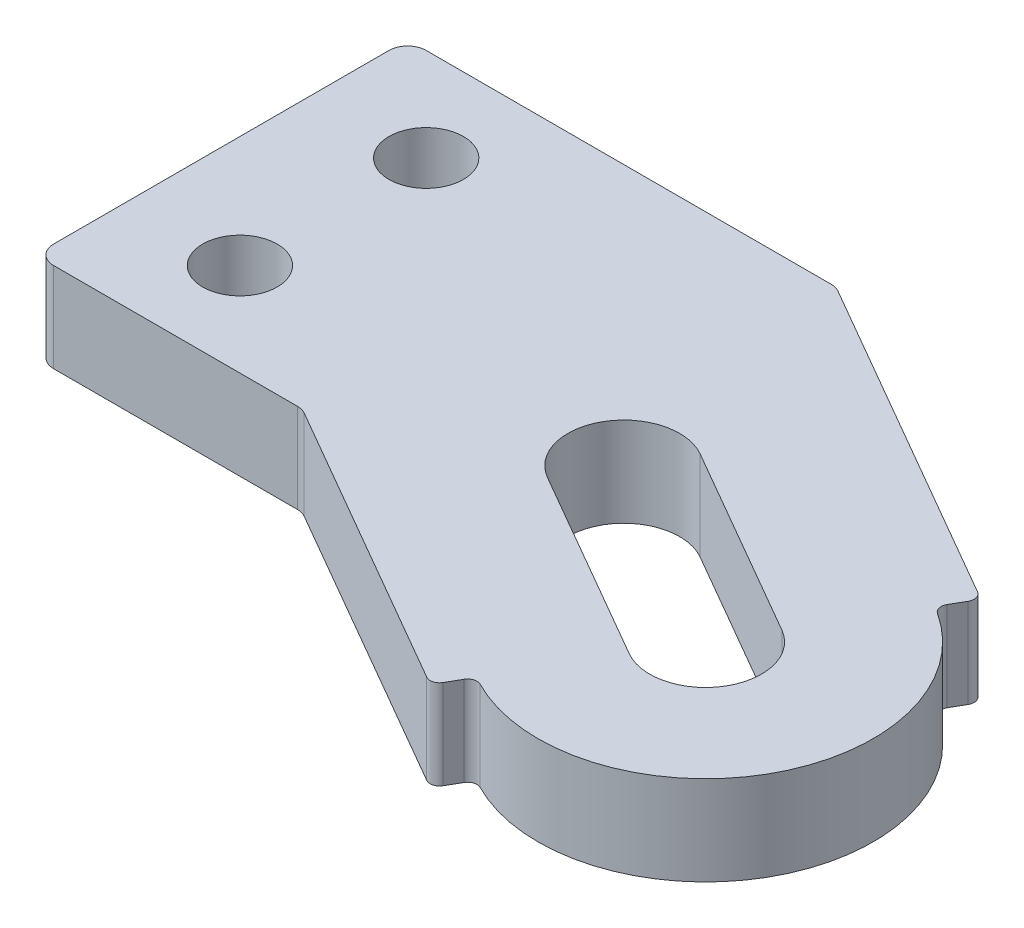
ISO-10303-21;
HEADER;
FILE_DESCRIPTION(('STEP AP214'),'2;1');
FILE_NAME('part.step','',(''),(''),'','','');
FILE_SCHEMA(('AUTOMOTIVE_DESIGN { 1 0 10303 214 1 1 1 1 }'));
ENDSEC;
DATA;
#1=APPLICATION_CONTEXT('core data for automotive mechanical design processes');
#2=APPLICATION_PROTOCOL_DEFINITION('international standard','automotive_design',2000,#1);
#3=PRODUCT_CONTEXT('',#1,'mechanical');
#4=PRODUCT('Part','Part','',(#3));
#5=PRODUCT_RELATED_PRODUCT_CATEGORY('part','',(#4));
#6=PRODUCT_DEFINITION_FORMATION('','',#4);
#7=PRODUCT_DEFINITION_CONTEXT('part definition',#1,'design');
#8=PRODUCT_DEFINITION('design','',#6,#7);
#9=PRODUCT_DEFINITION_SHAPE('','',#8);
#10=(LENGTH_UNIT() NAMED_UNIT(*) SI_UNIT(.MILLI.,.METRE.));
#11=(NAMED_UNIT(*) PLANE_ANGLE_UNIT() SI_UNIT($,.RADIAN.));
#12=(NAMED_UNIT(*) SI_UNIT($,.STERADIAN.) SOLID_ANGLE_UNIT());
#13=UNCERTAINTY_MEASURE_WITH_UNIT(LENGTH_MEASURE(1.E-05),#10,'distance_accuracy_value','');
#14=(GEOMETRIC_REPRESENTATION_CONTEXT(3) GLOBAL_UNCERTAINTY_ASSIGNED_CONTEXT((#13)) GLOBAL_UNIT_ASSIGNED_CONTEXT((#10,
#11,#12)) REPRESENTATION_CONTEXT('',''));
#15=CARTESIAN_POINT('',(0.,0.,0.));
#16=DIRECTION('',(0.,0.,1.));
#17=DIRECTION('',(1.,0.,0.));
#18=AXIS2_PLACEMENT_3D('',#15,#16,#17);
#19=CARTESIAN_POINT('',(6.80469575708595,6.,1.25));
#20=DIRECTION('',(0.,-1.,0.));
#21=DIRECTION('',(0.,0.,-1.));
#22=AXIS2_PLACEMENT_3D('',#19,#20,#21);
#23=PLANE('',#22);
#24=CARTESIAN_POINT('',(-14.1190975631527,6.,6.25));
#25=DIRECTION('',(0.,1.,0.));
#26=DIRECTION('',(0.,0.,-1.));
#27=AXIS2_PLACEMENT_3D('',#24,#25,#26);
#28=CIRCLE('',#27,2.5);
#29=CARTESIAN_POINT('',(-14.1190975631527,6.,3.75));
#30=VERTEX_POINT('',#29);
#31=EDGE_CURVE('E206',#30,#30,#28,.T.);
#32=ORIENTED_EDGE('',*,*,#31,.F.);
#33=EDGE_LOOP('',(#32));
#34=FACE_BOUND('',#33,.T.);
#35=CARTESIAN_POINT('',(-14.1190975631527,6.,18.75));
#36=DIRECTION('',(0.,1.,0.));
#37=DIRECTION('',(0.,0.,1.));
#38=AXIS2_PLACEMENT_3D('',#35,#36,#37);
#39=CIRCLE('',#38,2.5);
#40=CARTESIAN_POINT('',(-14.1190975631527,6.,21.25));
#41=VERTEX_POINT('',#40);
#42=EDGE_CURVE('E212',#41,#41,#39,.T.);
#43=ORIENTED_EDGE('',*,*,#42,.F.);
#44=EDGE_LOOP('',(#43));
#45=FACE_BOUND('',#44,.T.);
#46=CARTESIAN_POINT('',(6.80469575708595,6.,1.25));
#47=DIRECTION('',(0.,1.,0.));
#48=DIRECTION('',(0.,0.,-1.));
#49=AXIS2_PLACEMENT_3D('',#46,#47,#48);
#50=CIRCLE('',#49,1.24999999999999);
#51=CARTESIAN_POINT('',(7.42969575708592,6.,0.167468245269444));
#52=VERTEX_POINT('',#51);
#53=CARTESIAN_POINT('',(6.80469575708593,6.,0.));
#54=VERTEX_POINT('',#53);
#55=EDGE_CURVE('E218',#52,#54,#50,.T.);
#56=ORIENTED_EDGE('',*,*,#55,.T.);
#57=DIRECTION('',(-1.,0.,0.));
#58=VECTOR('',#57,1.);
#59=CARTESIAN_POINT('',(-20.3690975631527,6.,0.));
#60=LINE('',#59,#58);
#61=CARTESIAN_POINT('',(-20.3690975631527,6.,0.));
#62=VERTEX_POINT('',#61);
#63=EDGE_CURVE('E221',#54,#62,#60,.T.);
#64=ORIENTED_EDGE('',*,*,#63,.T.);
#65=CARTESIAN_POINT('',(-20.3690975631527,6.,1.25));
#66=DIRECTION('',(0.,1.,0.));
#67=DIRECTION('',(0.,0.,1.));
#68=AXIS2_PLACEMENT_3D('',#65,#66,#67);
#69=CIRCLE('',#68,1.25);
#70=CARTESIAN_POINT('',(-21.6190975631527,6.,1.25000000000001));
#71=VERTEX_POINT('',#70);
#72=EDGE_CURVE('E224',#62,#71,#69,.T.);
#73=ORIENTED_EDGE('',*,*,#72,.T.);
#74=DIRECTION('',(0.,0.,1.));
#75=VECTOR('',#74,1.);
#76=CARTESIAN_POINT('',(-21.6190975631527,6.,1.25000000000001));
#77=LINE('',#76,#75);
#78=CARTESIAN_POINT('',(-21.6190975631527,6.,23.75));
#79=VERTEX_POINT('',#78);
#80=EDGE_CURVE('E226',#71,#79,#77,.T.);
#81=ORIENTED_EDGE('',*,*,#80,.T.);
#82=CARTESIAN_POINT('',(-20.3690975631527,6.,23.75));
#83=DIRECTION('',(0.,1.,0.));
#84=DIRECTION('',(0.,0.,1.));
#85=AXIS2_PLACEMENT_3D('',#82,#83,#84);
#86=CIRCLE('',#85,1.25);
#87=CARTESIAN_POINT('',(-20.3690975631527,6.,25.));
#88=VERTEX_POINT('',#87);
#89=EDGE_CURVE('E228',#79,#88,#86,.T.);
#90=ORIENTED_EDGE('',*,*,#89,.T.);
#91=DIRECTION('',(1.,0.,0.));
#92=VECTOR('',#91,1.);
#93=CARTESIAN_POINT('',(-20.3690975631527,6.,25.));
#94=LINE('',#93,#92);
#95=CARTESIAN_POINT('',(-4.01403405369189,6.,25.));
#96=VERTEX_POINT('',#95);
#97=EDGE_CURVE('E230',#88,#96,#94,.T.);
#98=ORIENTED_EDGE('',*,*,#97,.T.);
#99=CARTESIAN_POINT('',(-4.0140340536919,6.,26.25));
#100=DIRECTION('',(0.,-1.,0.));
#101=DIRECTION('',(0.,0.,1.));
#102=AXIS2_PLACEMENT_3D('',#99,#100,#101);
#103=CIRCLE('',#102,1.25000000000001);
#104=CARTESIAN_POINT('',(-3.38903405369189,6.,25.1674682452695));
#105=VERTEX_POINT('',#104);
#106=EDGE_CURVE('E232',#96,#105,#103,.T.);
#107=ORIENTED_EDGE('',*,*,#106,.T.);
#108=DIRECTION('',(0.866025403784441,0.,0.499999999999995));
#109=VECTOR('',#108,1.);
#110=CARTESIAN_POINT('',(16.0703064324632,6.,36.4023237132035));
#111=LINE('',#110,#109);
#112=CARTESIAN_POINT('',(16.0703064324632,6.,36.4023237132035));
#113=VERTEX_POINT('',#112);
#114=EDGE_CURVE('E234',#105,#113,#111,.T.);
#115=ORIENTED_EDGE('',*,*,#114,.T.);
#116=CARTESIAN_POINT('',(16.3853064324631,6.,35.8567277088193));
#117=DIRECTION('',(0.,1.,0.));
#118=DIRECTION('',(0.,0.,-1.));
#119=AXIS2_PLACEMENT_3D('',#116,#117,#118);
#120=CIRCLE('',#119,0.629999999999999);
#121=CARTESIAN_POINT('',(16.9309024368473,6.,36.1717277088193));
#122=VERTEX_POINT('',#121);
#123=EDGE_CURVE('E236',#113,#122,#120,.T.);
#124=ORIENTED_EDGE('',*,*,#123,.T.);
#125=DIRECTION('',(0.500000000000004,0.,-0.866025403784436));
#126=VECTOR('',#125,1.);
#127=CARTESIAN_POINT('',(17.4492605899385,6.,35.2739050511478));
#128=LINE('',#127,#126);
#129=CARTESIAN_POINT('',(17.4492605899385,6.,35.2739050511478));
#130=VERTEX_POINT('',#129);
#131=EDGE_CURVE('E238',#122,#130,#128,.T.);
#132=ORIENTED_EDGE('',*,*,#131,.T.);
#133=CARTESIAN_POINT('',(17.9948565943227,6.,35.5889050511478));
#134=DIRECTION('',(0.,-1.,0.));
#135=DIRECTION('',(0.,0.,1.));
#136=AXIS2_PLACEMENT_3D('',#133,#134,#135);
#137=CIRCLE('',#136,0.629999999999999);
#138=CARTESIAN_POINT('',(18.2804802374869,6.,35.0273722075263));
#139=VERTEX_POINT('',#138);
#140=EDGE_CURVE('E240',#130,#139,#137,.T.);
#141=ORIENTED_EDGE('',*,*,#140,.T.);
#142=CARTESIAN_POINT('',(23.3809024368473,6.,25.));
#143=DIRECTION('',(0.,1.,0.));
#144=DIRECTION('',(0.,0.,1.));
#145=AXIS2_PLACEMENT_3D('',#142,#143,#144);
#146=CIRCLE('',#145,11.25);
#147=CARTESIAN_POINT('',(29.5146504020868,6.,15.5692187015646));
#148=VERTEX_POINT('',#147);
#149=EDGE_CURVE('E242',#139,#148,#146,.T.);
#150=ORIENTED_EDGE('',*,*,#149,.T.);
#151=CARTESIAN_POINT('',(29.8581402881402,6.,15.0410949488522));
#152=DIRECTION('',(0.,-1.,0.));
#153=DIRECTION('',(0.,0.,-1.));
#154=AXIS2_PLACEMENT_3D('',#151,#152,#153);
#155=CIRCLE('',#154,0.629999999999999);
#156=CARTESIAN_POINT('',(29.312544283756,6.,14.7260949488522));
#157=VERTEX_POINT('',#156);
#158=EDGE_CURVE('E244',#148,#157,#155,.T.);
#159=ORIENTED_EDGE('',*,*,#158,.T.);
#160=DIRECTION('',(0.499999999999998,0.,-0.86602540378444));
#161=VECTOR('',#160,1.);
#162=CARTESIAN_POINT('',(29.312544283756,6.,14.7260949488522));
#163=LINE('',#162,#161);
#164=CARTESIAN_POINT('',(29.8309024368472,6.,13.8282722911807));
#165=VERTEX_POINT('',#164);
#166=EDGE_CURVE('E246',#157,#165,#163,.T.);
#167=ORIENTED_EDGE('',*,*,#166,.T.);
#168=CARTESIAN_POINT('',(29.285306432463,6.,13.5132722911807));
#169=DIRECTION('',(0.,1.,0.));
#170=DIRECTION('',(0.,0.,-1.));
#171=AXIS2_PLACEMENT_3D('',#168,#169,#170);
#172=CIRCLE('',#171,0.630000000000001);
#173=CARTESIAN_POINT('',(29.600306432463,6.,12.9676762867965));
#174=VERTEX_POINT('',#173);
#175=EDGE_CURVE('E248',#165,#174,#172,.T.);
#176=ORIENTED_EDGE('',*,*,#175,.T.);
#177=DIRECTION('',(-0.866025403784443,0.,-0.499999999999992));
#178=VECTOR('',#177,1.);
#179=CARTESIAN_POINT('',(29.600306432463,6.,12.9676762867965));
#180=LINE('',#179,#178);
#181=EDGE_CURVE('E250',#174,#52,#180,.T.);
#182=ORIENTED_EDGE('',*,*,#181,.T.);
#183=EDGE_LOOP('',(#56,#64,#73,#81,#90,#98,#107,#115,#124,#132,#141,#150,#159,#167,#176,#182));
#184=FACE_BOUND('',#183,.T.);
#185=CARTESIAN_POINT('',(23.3809024368473,6.,25.));
#186=DIRECTION('',(0.,1.,0.));
#187=DIRECTION('',(0.,0.,1.));
#188=AXIS2_PLACEMENT_3D('',#185,#186,#187);
#189=CIRCLE('',#188,3.75);
#190=CARTESIAN_POINT('',(21.5059024368473,6.,28.2475952641917));
#191=VERTEX_POINT('',#190);
#192=CARTESIAN_POINT('',(25.2559024368473,6.,21.7524047358083));
#193=VERTEX_POINT('',#192);
#194=EDGE_CURVE('E170',#191,#193,#189,.T.);
#195=ORIENTED_EDGE('',*,*,#194,.F.);
#196=DIRECTION('',(0.86602540378444,0.,0.499999999999998));
#197=VECTOR('',#196,1.);
#198=CARTESIAN_POINT('',(21.5059024368473,6.,28.2475952641917));
#199=LINE('',#198,#197);
#200=CARTESIAN_POINT('',(8.5155213800807,6.,20.7475952641917));
#201=VERTEX_POINT('',#200);
#202=EDGE_CURVE('E192',#201,#191,#199,.T.);
#203=ORIENTED_EDGE('',*,*,#202,.F.);
#204=CARTESIAN_POINT('',(10.3905213800806,6.,17.5000000000001));
#205=DIRECTION('',(0.,1.,0.));
#206=DIRECTION('',(0.,0.,1.));
#207=AXIS2_PLACEMENT_3D('',#204,#205,#206);
#208=CIRCLE('',#207,3.74999999999994);
#209=CARTESIAN_POINT('',(12.2655213800806,6.,14.2524047358085));
#210=VERTEX_POINT('',#209);
#211=EDGE_CURVE('E190',#210,#201,#208,.T.);
#212=ORIENTED_EDGE('',*,*,#211,.F.);
#213=DIRECTION('',(-0.866025403784444,0.,-0.499999999999991));
#214=VECTOR('',#213,1.);
#215=CARTESIAN_POINT('',(25.2559024368473,6.,21.7524047358083));
#216=LINE('',#215,#214);
#217=EDGE_CURVE('E178',#193,#210,#216,.T.);
#218=ORIENTED_EDGE('',*,*,#217,.F.);
#219=EDGE_LOOP('',(#195,#203,#212,#218));
#220=FACE_BOUND('',#219,.T.);
#221=ADVANCED_FACE('F33',(#34,#45,#184,#220),#23,.F.);
#222=CARTESIAN_POINT('',(6.80469575708595,0.,1.25));
#223=DIRECTION('',(0.,-1.,0.));
#224=DIRECTION('',(0.,0.,-1.));
#225=AXIS2_PLACEMENT_3D('',#222,#223,#224);
#226=PLANE('',#225);
#227=CARTESIAN_POINT('',(-14.1190975631527,0.,18.75));
#228=DIRECTION('',(0.,1.,0.));
#229=DIRECTION('',(0.,0.,1.));
#230=AXIS2_PLACEMENT_3D('',#227,#228,#229);
#231=CIRCLE('',#230,2.5);
#232=CARTESIAN_POINT('',(-14.1190975631527,0.,21.25));
#233=VERTEX_POINT('',#232);
#234=EDGE_CURVE('E209',#233,#233,#231,.T.);
#235=ORIENTED_EDGE('',*,*,#234,.T.);
#236=EDGE_LOOP('',(#235));
#237=FACE_BOUND('',#236,.T.);
#238=CARTESIAN_POINT('',(6.80469575708595,0.,1.25));
#239=DIRECTION('',(0.,1.,0.));
#240=DIRECTION('',(0.,0.,-1.));
#241=AXIS2_PLACEMENT_3D('',#238,#239,#240);
#242=CIRCLE('',#241,1.24999999999999);
#243=CARTESIAN_POINT('',(7.42969575708592,0.,0.167468245269444));
#244=VERTEX_POINT('',#243);
#245=CARTESIAN_POINT('',(6.80469575708593,0.,0.));
#246=VERTEX_POINT('',#245);
#247=EDGE_CURVE('E215',#244,#246,#242,.T.);
#248=ORIENTED_EDGE('',*,*,#247,.F.);
#249=DIRECTION('',(-0.866025403784443,0.,-0.499999999999992));
#250=VECTOR('',#249,1.);
#251=CARTESIAN_POINT('',(29.600306432463,0.,12.9676762867965));
#252=LINE('',#251,#250);
#253=CARTESIAN_POINT('',(29.600306432463,0.,12.9676762867965));
#254=VERTEX_POINT('',#253);
#255=EDGE_CURVE('E222',#254,#244,#252,.T.);
#256=ORIENTED_EDGE('',*,*,#255,.F.);
#257=CARTESIAN_POINT('',(29.285306432463,0.,13.5132722911807));
#258=DIRECTION('',(0.,1.,0.));
#259=DIRECTION('',(0.,0.,-1.));
#260=AXIS2_PLACEMENT_3D('',#257,#258,#259);
#261=CIRCLE('',#260,0.630000000000001);
#262=CARTESIAN_POINT('',(29.8309024368472,0.,13.8282722911807));
#263=VERTEX_POINT('',#262);
#264=EDGE_CURVE('E281',#263,#254,#261,.T.);
#265=ORIENTED_EDGE('',*,*,#264,.F.);
#266=DIRECTION('',(0.499999999999998,0.,-0.86602540378444));
#267=VECTOR('',#266,1.);
#268=CARTESIAN_POINT('',(29.312544283756,0.,14.7260949488522));
#269=LINE('',#268,#267);
#270=CARTESIAN_POINT('',(29.312544283756,0.,14.7260949488522));
#271=VERTEX_POINT('',#270);
#272=EDGE_CURVE('E279',#271,#263,#269,.T.);
#273=ORIENTED_EDGE('',*,*,#272,.F.);
#274=CARTESIAN_POINT('',(29.8581402881402,0.,15.0410949488522));
#275=DIRECTION('',(0.,-1.,0.));
#276=DIRECTION('',(0.,0.,-1.));
#277=AXIS2_PLACEMENT_3D('',#274,#275,#276);
#278=CIRCLE('',#277,0.629999999999999);
#279=CARTESIAN_POINT('',(29.5146504020868,0.,15.5692187015646));
#280=VERTEX_POINT('',#279);
#281=EDGE_CURVE('E277',#280,#271,#278,.T.);
#282=ORIENTED_EDGE('',*,*,#281,.F.);
#283=CARTESIAN_POINT('',(23.3809024368473,0.,25.));
#284=DIRECTION('',(0.,1.,0.));
#285=DIRECTION('',(0.,0.,1.));
#286=AXIS2_PLACEMENT_3D('',#283,#284,#285);
#287=CIRCLE('',#286,11.25);
#288=CARTESIAN_POINT('',(18.2804802374869,0.,35.0273722075263));
#289=VERTEX_POINT('',#288);
#290=EDGE_CURVE('E275',#289,#280,#287,.T.);
#291=ORIENTED_EDGE('',*,*,#290,.F.);
#292=CARTESIAN_POINT('',(17.9948565943227,0.,35.5889050511478));
#293=DIRECTION('',(0.,-1.,0.));
#294=DIRECTION('',(0.,0.,1.));
#295=AXIS2_PLACEMENT_3D('',#292,#293,#294);
#296=CIRCLE('',#295,0.629999999999999);
#297=CARTESIAN_POINT('',(17.4492605899385,0.,35.2739050511478));
#298=VERTEX_POINT('',#297);
#299=EDGE_CURVE('E273',#298,#289,#296,.T.);
#300=ORIENTED_EDGE('',*,*,#299,.F.);
#301=DIRECTION('',(0.500000000000004,0.,-0.866025403784436));
#302=VECTOR('',#301,1.);
#303=CARTESIAN_POINT('',(17.4492605899385,0.,35.2739050511478));
#304=LINE('',#303,#302);
#305=CARTESIAN_POINT('',(16.9309024368473,0.,36.1717277088193));
#306=VERTEX_POINT('',#305);
#307=EDGE_CURVE('E271',#306,#298,#304,.T.);
#308=ORIENTED_EDGE('',*,*,#307,.F.);
#309=CARTESIAN_POINT('',(16.3853064324631,0.,35.8567277088193));
#310=DIRECTION('',(0.,1.,0.));
#311=DIRECTION('',(0.,0.,-1.));
#312=AXIS2_PLACEMENT_3D('',#309,#310,#311);
#313=CIRCLE('',#312,0.629999999999999);
#314=CARTESIAN_POINT('',(16.0703064324632,0.,36.4023237132035));
#315=VERTEX_POINT('',#314);
#316=EDGE_CURVE('E269',#315,#306,#313,.T.);
#317=ORIENTED_EDGE('',*,*,#316,.F.);
#318=DIRECTION('',(0.866025403784441,0.,0.499999999999995));
#319=VECTOR('',#318,1.);
#320=CARTESIAN_POINT('',(16.0703064324632,0.,36.4023237132035));
#321=LINE('',#320,#319);
#322=CARTESIAN_POINT('',(-3.38903405369189,0.,25.1674682452695));
#323=VERTEX_POINT('',#322);
#324=EDGE_CURVE('E267',#323,#315,#321,.T.);
#325=ORIENTED_EDGE('',*,*,#324,.F.);
#326=CARTESIAN_POINT('',(-4.0140340536919,0.,26.25));
#327=DIRECTION('',(0.,-1.,0.));
#328=DIRECTION('',(0.,0.,1.));
#329=AXIS2_PLACEMENT_3D('',#326,#327,#328);
#330=CIRCLE('',#329,1.25000000000001);
#331=CARTESIAN_POINT('',(-4.01403405369189,0.,25.));
#332=VERTEX_POINT('',#331);
#333=EDGE_CURVE('E265',#332,#323,#330,.T.);
#334=ORIENTED_EDGE('',*,*,#333,.F.);
#335=DIRECTION('',(1.,0.,0.));
#336=VECTOR('',#335,1.);
#337=CARTESIAN_POINT('',(-20.3690975631527,0.,25.));
#338=LINE('',#337,#336);
#339=CARTESIAN_POINT('',(-20.3690975631527,0.,25.));
#340=VERTEX_POINT('',#339);
#341=EDGE_CURVE('E263',#340,#332,#338,.T.);
#342=ORIENTED_EDGE('',*,*,#341,.F.);
#343=CARTESIAN_POINT('',(-20.3690975631527,0.,23.75));
#344=DIRECTION('',(0.,1.,0.));
#345=DIRECTION('',(0.,0.,1.));
#346=AXIS2_PLACEMENT_3D('',#343,#344,#345);
#347=CIRCLE('',#346,1.25);
#348=CARTESIAN_POINT('',(-21.6190975631527,0.,23.75));
#349=VERTEX_POINT('',#348);
#350=EDGE_CURVE('E261',#349,#340,#347,.T.);
#351=ORIENTED_EDGE('',*,*,#350,.F.);
#352=DIRECTION('',(0.,0.,1.));
#353=VECTOR('',#352,1.);
#354=CARTESIAN_POINT('',(-21.6190975631527,0.,1.25000000000001));
#355=LINE('',#354,#353);
#356=CARTESIAN_POINT('',(-21.6190975631527,0.,1.25000000000001));
#357=VERTEX_POINT('',#356);
#358=EDGE_CURVE('E259',#357,#349,#355,.T.);
#359=ORIENTED_EDGE('',*,*,#358,.F.);
#360=CARTESIAN_POINT('',(-20.3690975631527,0.,1.25));
#361=DIRECTION('',(0.,1.,0.));
#362=DIRECTION('',(0.,0.,1.));
#363=AXIS2_PLACEMENT_3D('',#360,#361,#362);
#364=CIRCLE('',#363,1.25);
#365=CARTESIAN_POINT('',(-20.3690975631527,0.,0.));
#366=VERTEX_POINT('',#365);
#367=EDGE_CURVE('E257',#366,#357,#364,.T.);
#368=ORIENTED_EDGE('',*,*,#367,.F.);
#369=DIRECTION('',(-1.,0.,0.));
#370=VECTOR('',#369,1.);
#371=CARTESIAN_POINT('',(-20.3690975631527,0.,0.));
#372=LINE('',#371,#370);
#373=EDGE_CURVE('E255',#246,#366,#372,.T.);
#374=ORIENTED_EDGE('',*,*,#373,.F.);
#375=EDGE_LOOP('',(#248,#256,#265,#273,#282,#291,#300,#308,#317,#325,#334,#342,#351,#359,#368,#374));
#376=FACE_BOUND('',#375,.T.);
#377=CARTESIAN_POINT('',(-14.1190975631527,0.,6.25));
#378=DIRECTION('',(0.,1.,0.));
#379=DIRECTION('',(0.,0.,-1.));
#380=AXIS2_PLACEMENT_3D('',#377,#378,#379);
#381=CIRCLE('',#380,2.5);
#382=CARTESIAN_POINT('',(-14.1190975631527,0.,3.75));
#383=VERTEX_POINT('',#382);
#384=EDGE_CURVE('E186',#383,#383,#381,.T.);
#385=ORIENTED_EDGE('',*,*,#384,.T.);
#386=EDGE_LOOP('',(#385));
#387=FACE_BOUND('',#386,.T.);
#388=DIRECTION('',(0.86602540378444,0.,0.499999999999998));
#389=VECTOR('',#388,1.);
#390=CARTESIAN_POINT('',(21.5059024368473,0.,28.2475952641917));
#391=LINE('',#390,#389);
#392=CARTESIAN_POINT('',(8.5155213800807,0.,20.7475952641917));
#393=VERTEX_POINT('',#392);
#394=CARTESIAN_POINT('',(21.5059024368473,0.,28.2475952641917));
#395=VERTEX_POINT('',#394);
#396=EDGE_CURVE('E179',#393,#395,#391,.T.);
#397=ORIENTED_EDGE('',*,*,#396,.T.);
#398=CARTESIAN_POINT('',(23.3809024368473,0.,25.));
#399=DIRECTION('',(0.,1.,0.));
#400=DIRECTION('',(0.,0.,1.));
#401=AXIS2_PLACEMENT_3D('',#398,#399,#400);
#402=CIRCLE('',#401,3.75);
#403=CARTESIAN_POINT('',(25.2559024368473,0.,21.7524047358083));
#404=VERTEX_POINT('',#403);
#405=EDGE_CURVE('E56',#395,#404,#402,.T.);
#406=ORIENTED_EDGE('',*,*,#405,.T.);
#407=DIRECTION('',(-0.866025403784444,0.,-0.499999999999991));
#408=VECTOR('',#407,1.);
#409=CARTESIAN_POINT('',(25.2559024368473,0.,21.7524047358083));
#410=LINE('',#409,#408);
#411=CARTESIAN_POINT('',(12.2655213800806,0.,14.2524047358085));
#412=VERTEX_POINT('',#411);
#413=EDGE_CURVE('E185',#404,#412,#410,.T.);
#414=ORIENTED_EDGE('',*,*,#413,.T.);
#415=CARTESIAN_POINT('',(10.3905213800806,0.,17.5000000000001));
#416=DIRECTION('',(0.,1.,0.));
#417=DIRECTION('',(0.,0.,1.));
#418=AXIS2_PLACEMENT_3D('',#415,#416,#417);
#419=CIRCLE('',#418,3.74999999999994);
#420=EDGE_CURVE('E198',#412,#393,#419,.T.);
#421=ORIENTED_EDGE('',*,*,#420,.T.);
#422=EDGE_LOOP('',(#397,#406,#414,#421));
#423=FACE_BOUND('',#422,.T.);
#424=ADVANCED_FACE('F335',(#237,#376,#387,#423),#226,.T.);
#425=CARTESIAN_POINT('',(6.80469575708595,6.,1.25));
#426=DIRECTION('',(0.,-1.,0.));
#427=DIRECTION('',(0.,0.,-1.));
#428=AXIS2_PLACEMENT_3D('',#425,#426,#427);
#429=CYLINDRICAL_SURFACE('',#428,1.24999999999999);
#430=ORIENTED_EDGE('',*,*,#247,.T.);
#431=DIRECTION('',(0.,-1.,0.));
#432=VECTOR('',#431,1.);
#433=CARTESIAN_POINT('',(6.80469575708593,6.,0.));
#434=LINE('',#433,#432);
#435=EDGE_CURVE('E11',#54,#246,#434,.T.);
#436=ORIENTED_EDGE('',*,*,#435,.F.);
#437=ORIENTED_EDGE('',*,*,#55,.F.);
#438=DIRECTION('',(0.,-1.,0.));
#439=VECTOR('',#438,1.);
#440=CARTESIAN_POINT('',(7.42969575708592,6.,0.167468245269444));
#441=LINE('',#440,#439);
#442=EDGE_CURVE('E252',#52,#244,#441,.T.);
#443=ORIENTED_EDGE('',*,*,#442,.T.);
#444=EDGE_LOOP('',(#430,#436,#437,#443));
#445=FACE_BOUND('',#444,.T.);
#446=ADVANCED_FACE('F35',(#445),#429,.T.);
#447=CARTESIAN_POINT('',(-20.3690975631527,6.,0.));
#448=DIRECTION('',(0.,0.,1.));
#449=DIRECTION('',(1.,0.,0.));
#450=AXIS2_PLACEMENT_3D('',#447,#448,#449);
#451=PLANE('',#450);
#452=ORIENTED_EDGE('',*,*,#373,.T.);
#453=DIRECTION('',(0.,-1.,0.));
#454=VECTOR('',#453,1.);
#455=CARTESIAN_POINT('',(-20.3690975631527,6.,0.));
#456=LINE('',#455,#454);
#457=EDGE_CURVE('E41',#62,#366,#456,.T.);
#458=ORIENTED_EDGE('',*,*,#457,.F.);
#459=ORIENTED_EDGE('',*,*,#63,.F.);
#460=ORIENTED_EDGE('',*,*,#435,.T.);
#461=EDGE_LOOP('',(#452,#458,#459,#460));
#462=FACE_BOUND('',#461,.T.);
#463=ADVANCED_FACE('F352',(#462),#451,.F.);
#464=CARTESIAN_POINT('',(-20.3690975631527,6.,1.25));
#465=DIRECTION('',(0.,-1.,0.));
#466=DIRECTION('',(0.,0.,-1.));
#467=AXIS2_PLACEMENT_3D('',#464,#465,#466);
#468=CYLINDRICAL_SURFACE('',#467,1.25);
#469=ORIENTED_EDGE('',*,*,#367,.T.);
#470=DIRECTION('',(0.,-1.,0.));
#471=VECTOR('',#470,1.);
#472=CARTESIAN_POINT('',(-21.6190975631527,6.,1.25000000000001));
#473=LINE('',#472,#471);
#474=EDGE_CURVE('E322',#71,#357,#473,.T.);
#475=ORIENTED_EDGE('',*,*,#474,.F.);
#476=ORIENTED_EDGE('',*,*,#72,.F.);
#477=ORIENTED_EDGE('',*,*,#457,.T.);
#478=EDGE_LOOP('',(#469,#475,#476,#477));
#479=FACE_BOUND('',#478,.T.);
#480=ADVANCED_FACE('F329',(#479),#468,.T.);
#481=CARTESIAN_POINT('',(-21.6190975631527,6.,1.25000000000001));
#482=DIRECTION('',(1.,0.,0.));
#483=DIRECTION('',(0.,0.,-1.));
#484=AXIS2_PLACEMENT_3D('',#481,#482,#483);
#485=PLANE('',#484);
#486=ORIENTED_EDGE('',*,*,#358,.T.);
#487=DIRECTION('',(0.,-1.,0.));
#488=VECTOR('',#487,1.);
#489=CARTESIAN_POINT('',(-21.6190975631527,6.,23.75));
#490=LINE('',#489,#488);
#491=EDGE_CURVE('E319',#79,#349,#490,.T.);
#492=ORIENTED_EDGE('',*,*,#491,.F.);
#493=ORIENTED_EDGE('',*,*,#80,.F.);
#494=ORIENTED_EDGE('',*,*,#474,.T.);
#495=EDGE_LOOP('',(#486,#492,#493,#494));
#496=FACE_BOUND('',#495,.T.);
#497=ADVANCED_FACE('F341',(#496),#485,.F.);
#498=CARTESIAN_POINT('',(-20.3690975631527,6.,23.75));
#499=DIRECTION('',(0.,-1.,0.));
#500=DIRECTION('',(0.,0.,-1.));
#501=AXIS2_PLACEMENT_3D('',#498,#499,#500);
#502=CYLINDRICAL_SURFACE('',#501,1.25);
#503=ORIENTED_EDGE('',*,*,#350,.T.);
#504=DIRECTION('',(0.,-1.,0.));
#505=VECTOR('',#504,1.);
#506=CARTESIAN_POINT('',(-20.3690975631527,6.,25.));
#507=LINE('',#506,#505);
#508=EDGE_CURVE('E316',#88,#340,#507,.T.);
#509=ORIENTED_EDGE('',*,*,#508,.F.);
#510=ORIENTED_EDGE('',*,*,#89,.F.);
#511=ORIENTED_EDGE('',*,*,#491,.T.);
#512=EDGE_LOOP('',(#503,#509,#510,#511));
#513=FACE_BOUND('',#512,.T.);
#514=ADVANCED_FACE('F345',(#513),#502,.T.);
#515=CARTESIAN_POINT('',(-20.3690975631527,6.,25.));
#516=DIRECTION('',(0.,0.,-1.));
#517=DIRECTION('',(-1.,0.,0.));
#518=AXIS2_PLACEMENT_3D('',#515,#516,#517);
#519=PLANE('',#518);
#520=ORIENTED_EDGE('',*,*,#341,.T.);
#521=DIRECTION('',(0.,-1.,0.));
#522=VECTOR('',#521,1.);
#523=CARTESIAN_POINT('',(-4.01403405369189,6.,25.));
#524=LINE('',#523,#522);
#525=EDGE_CURVE('E313',#96,#332,#524,.T.);
#526=ORIENTED_EDGE('',*,*,#525,.F.);
#527=ORIENTED_EDGE('',*,*,#97,.F.);
#528=ORIENTED_EDGE('',*,*,#508,.T.);
#529=EDGE_LOOP('',(#520,#526,#527,#528));
#530=FACE_BOUND('',#529,.T.);
#531=ADVANCED_FACE('F405',(#530),#519,.F.);
#532=CARTESIAN_POINT('',(-4.0140340536919,6.,26.25));
#533=DIRECTION('',(0.,-1.,0.));
#534=DIRECTION('',(0.,0.,-1.));
#535=AXIS2_PLACEMENT_3D('',#532,#533,#534);
#536=CYLINDRICAL_SURFACE('',#535,1.25000000000001);
#537=ORIENTED_EDGE('',*,*,#333,.T.);
#538=DIRECTION('',(0.,-1.,0.));
#539=VECTOR('',#538,1.);
#540=CARTESIAN_POINT('',(-3.38903405369189,6.,25.1674682452695));
#541=LINE('',#540,#539);
#542=EDGE_CURVE('E310',#105,#323,#541,.T.);
#543=ORIENTED_EDGE('',*,*,#542,.F.);
#544=ORIENTED_EDGE('',*,*,#106,.F.);
#545=ORIENTED_EDGE('',*,*,#525,.T.);
#546=EDGE_LOOP('',(#537,#543,#544,#545));
#547=FACE_BOUND('',#546,.T.);
#548=ADVANCED_FACE('F402',(#547),#536,.F.);
#549=CARTESIAN_POINT('',(16.0703064324632,6.,36.4023237132035));
#550=DIRECTION('',(0.499999999999995,0.,-0.866025403784441));
#551=DIRECTION('',(-0.866025403784441,0.,-0.499999999999995));
#552=AXIS2_PLACEMENT_3D('',#549,#550,#551);
#553=PLANE('',#552);
#554=ORIENTED_EDGE('',*,*,#324,.T.);
#555=DIRECTION('',(0.,-1.,0.));
#556=VECTOR('',#555,1.);
#557=CARTESIAN_POINT('',(16.0703064324632,6.,36.4023237132035));
#558=LINE('',#557,#556);
#559=EDGE_CURVE('E307',#113,#315,#558,.T.);
#560=ORIENTED_EDGE('',*,*,#559,.F.);
#561=ORIENTED_EDGE('',*,*,#114,.F.);
#562=ORIENTED_EDGE('',*,*,#542,.T.);
#563=EDGE_LOOP('',(#554,#560,#561,#562));
#564=FACE_BOUND('',#563,.T.);
#565=ADVANCED_FACE('F398',(#564),#553,.F.);
#566=CARTESIAN_POINT('',(16.3853064324631,6.,35.8567277088193));
#567=DIRECTION('',(0.,-1.,0.));
#568=DIRECTION('',(0.,0.,-1.));
#569=AXIS2_PLACEMENT_3D('',#566,#567,#568);
#570=CYLINDRICAL_SURFACE('',#569,0.629999999999999);
#571=ORIENTED_EDGE('',*,*,#316,.T.);
#572=DIRECTION('',(0.,-1.,0.));
#573=VECTOR('',#572,1.);
#574=CARTESIAN_POINT('',(16.9309024368473,6.,36.1717277088193));
#575=LINE('',#574,#573);
#576=EDGE_CURVE('E304',#122,#306,#575,.T.);
#577=ORIENTED_EDGE('',*,*,#576,.F.);
#578=ORIENTED_EDGE('',*,*,#123,.F.);
#579=ORIENTED_EDGE('',*,*,#559,.T.);
#580=EDGE_LOOP('',(#571,#577,#578,#579));
#581=FACE_BOUND('',#580,.T.);
#582=ADVANCED_FACE('F394',(#581),#570,.T.);
#583=CARTESIAN_POINT('',(17.4492605899385,6.,35.2739050511478));
#584=DIRECTION('',(-0.866025403784436,0.,-0.500000000000004));
#585=DIRECTION('',(-0.500000000000004,0.,0.866025403784436));
#586=AXIS2_PLACEMENT_3D('',#583,#584,#585);
#587=PLANE('',#586);
#588=ORIENTED_EDGE('',*,*,#307,.T.);
#589=DIRECTION('',(0.,-1.,0.));
#590=VECTOR('',#589,1.);
#591=CARTESIAN_POINT('',(17.4492605899385,6.,35.2739050511478));
#592=LINE('',#591,#590);
#593=EDGE_CURVE('E301',#130,#298,#592,.T.);
#594=ORIENTED_EDGE('',*,*,#593,.F.);
#595=ORIENTED_EDGE('',*,*,#131,.F.);
#596=ORIENTED_EDGE('',*,*,#576,.T.);
#597=EDGE_LOOP('',(#588,#594,#595,#596));
#598=FACE_BOUND('',#597,.T.);
#599=ADVANCED_FACE('F389',(#598),#587,.F.);
#600=CARTESIAN_POINT('',(17.9948565943227,6.,35.5889050511478));
#601=DIRECTION('',(0.,-1.,0.));
#602=DIRECTION('',(0.,0.,-1.));
#603=AXIS2_PLACEMENT_3D('',#600,#601,#602);
#604=CYLINDRICAL_SURFACE('',#603,0.629999999999999);
#605=ORIENTED_EDGE('',*,*,#299,.T.);
#606=DIRECTION('',(0.,-1.,0.));
#607=VECTOR('',#606,1.);
#608=CARTESIAN_POINT('',(18.2804802374869,6.,35.0273722075263));
#609=LINE('',#608,#607);
#610=EDGE_CURVE('E298',#139,#289,#609,.T.);
#611=ORIENTED_EDGE('',*,*,#610,.F.);
#612=ORIENTED_EDGE('',*,*,#140,.F.);
#613=ORIENTED_EDGE('',*,*,#593,.T.);
#614=EDGE_LOOP('',(#605,#611,#612,#613));
#615=FACE_BOUND('',#614,.T.);
#616=ADVANCED_FACE('F383',(#615),#604,.F.);
#617=CARTESIAN_POINT('',(23.3809024368473,6.,25.));
#618=DIRECTION('',(0.,-1.,0.));
#619=DIRECTION('',(0.,0.,-1.));
#620=AXIS2_PLACEMENT_3D('',#617,#618,#619);
#621=CYLINDRICAL_SURFACE('',#620,11.25);
#622=ORIENTED_EDGE('',*,*,#290,.T.);
#623=DIRECTION('',(0.,-1.,0.));
#624=VECTOR('',#623,1.);
#625=CARTESIAN_POINT('',(29.5146504020868,6.,15.5692187015646));
#626=LINE('',#625,#624);
#627=EDGE_CURVE('E295',#148,#280,#626,.T.);
#628=ORIENTED_EDGE('',*,*,#627,.F.);
#629=ORIENTED_EDGE('',*,*,#149,.F.);
#630=ORIENTED_EDGE('',*,*,#610,.T.);
#631=EDGE_LOOP('',(#622,#628,#629,#630));
#632=FACE_BOUND('',#631,.T.);
#633=ADVANCED_FACE('F379',(#632),#621,.T.);
#634=CARTESIAN_POINT('',(29.8581402881402,6.,15.0410949488522));
#635=DIRECTION('',(0.,-1.,0.));
#636=DIRECTION('',(0.,0.,-1.));
#637=AXIS2_PLACEMENT_3D('',#634,#635,#636);
#638=CYLINDRICAL_SURFACE('',#637,0.629999999999999);
#639=ORIENTED_EDGE('',*,*,#281,.T.);
#640=DIRECTION('',(0.,-1.,0.));
#641=VECTOR('',#640,1.);
#642=CARTESIAN_POINT('',(29.312544283756,6.,14.7260949488522));
#643=LINE('',#642,#641);
#644=EDGE_CURVE('E292',#157,#271,#643,.T.);
#645=ORIENTED_EDGE('',*,*,#644,.F.);
#646=ORIENTED_EDGE('',*,*,#158,.F.);
#647=ORIENTED_EDGE('',*,*,#627,.T.);
#648=EDGE_LOOP('',(#639,#645,#646,#647));
#649=FACE_BOUND('',#648,.T.);
#650=ADVANCED_FACE('F374',(#649),#638,.F.);
#651=CARTESIAN_POINT('',(29.312544283756,6.,14.7260949488522));
#652=DIRECTION('',(-0.86602540378444,0.,-0.499999999999998));
#653=DIRECTION('',(-0.499999999999998,0.,0.86602540378444));
#654=AXIS2_PLACEMENT_3D('',#651,#652,#653);
#655=PLANE('',#654);
#656=ORIENTED_EDGE('',*,*,#272,.T.);
#657=DIRECTION('',(0.,-1.,0.));
#658=VECTOR('',#657,1.);
#659=CARTESIAN_POINT('',(29.8309024368472,6.,13.8282722911807));
#660=LINE('',#659,#658);
#661=EDGE_CURVE('E289',#165,#263,#660,.T.);
#662=ORIENTED_EDGE('',*,*,#661,.F.);
#663=ORIENTED_EDGE('',*,*,#166,.F.);
#664=ORIENTED_EDGE('',*,*,#644,.T.);
#665=EDGE_LOOP('',(#656,#662,#663,#664));
#666=FACE_BOUND('',#665,.T.);
#667=ADVANCED_FACE('F368',(#666),#655,.F.);
#668=CARTESIAN_POINT('',(29.285306432463,6.,13.5132722911807));
#669=DIRECTION('',(0.,-1.,0.));
#670=DIRECTION('',(0.,0.,-1.));
#671=AXIS2_PLACEMENT_3D('',#668,#669,#670);
#672=CYLINDRICAL_SURFACE('',#671,0.630000000000001);
#673=ORIENTED_EDGE('',*,*,#264,.T.);
#674=DIRECTION('',(0.,-1.,0.));
#675=VECTOR('',#674,1.);
#676=CARTESIAN_POINT('',(29.600306432463,6.,12.9676762867965));
#677=LINE('',#676,#675);
#678=EDGE_CURVE('E286',#174,#254,#677,.T.);
#679=ORIENTED_EDGE('',*,*,#678,.F.);
#680=ORIENTED_EDGE('',*,*,#175,.F.);
#681=ORIENTED_EDGE('',*,*,#661,.T.);
#682=EDGE_LOOP('',(#673,#679,#680,#681));
#683=FACE_BOUND('',#682,.T.);
#684=ADVANCED_FACE('F364',(#683),#672,.T.);
#685=CARTESIAN_POINT('',(29.600306432463,6.,12.9676762867965));
#686=DIRECTION('',(-0.499999999999992,0.,0.866025403784443));
#687=DIRECTION('',(0.866025403784443,0.,0.499999999999992));
#688=AXIS2_PLACEMENT_3D('',#685,#686,#687);
#689=PLANE('',#688);
#690=ORIENTED_EDGE('',*,*,#255,.T.);
#691=ORIENTED_EDGE('',*,*,#442,.F.);
#692=ORIENTED_EDGE('',*,*,#181,.F.);
#693=ORIENTED_EDGE('',*,*,#678,.T.);
#694=EDGE_LOOP('',(#690,#691,#692,#693));
#695=FACE_BOUND('',#694,.T.);
#696=ADVANCED_FACE('F359',(#695),#689,.F.);
#697=CARTESIAN_POINT('',(-14.1190975631527,6.,18.75));
#698=DIRECTION('',(0.,-1.,0.));
#699=DIRECTION('',(0.,0.,-1.));
#700=AXIS2_PLACEMENT_3D('',#697,#698,#699);
#701=CYLINDRICAL_SURFACE('',#700,2.5);
#702=ORIENTED_EDGE('',*,*,#42,.T.);
#703=EDGE_LOOP('',(#702));
#704=FACE_BOUND('',#703,.T.);
#705=ORIENTED_EDGE('',*,*,#234,.F.);
#706=EDGE_LOOP('',(#705));
#707=FACE_BOUND('',#706,.T.);
#708=ADVANCED_FACE('F425',(#704,#707),#701,.F.);
#709=CARTESIAN_POINT('',(-14.1190975631527,6.,6.25));
#710=DIRECTION('',(0.,-1.,0.));
#711=DIRECTION('',(0.,0.,-1.));
#712=AXIS2_PLACEMENT_3D('',#709,#710,#711);
#713=CYLINDRICAL_SURFACE('',#712,2.5);
#714=ORIENTED_EDGE('',*,*,#31,.T.);
#715=EDGE_LOOP('',(#714));
#716=FACE_BOUND('',#715,.T.);
#717=ORIENTED_EDGE('',*,*,#384,.F.);
#718=EDGE_LOOP('',(#717));
#719=FACE_BOUND('',#718,.T.);
#720=ADVANCED_FACE('F487',(#716,#719),#713,.F.);
#721=CARTESIAN_POINT('',(23.3809024368473,6.,25.));
#722=DIRECTION('',(0.,-1.,0.));
#723=DIRECTION('',(0.,0.,-1.));
#724=AXIS2_PLACEMENT_3D('',#721,#722,#723);
#725=CYLINDRICAL_SURFACE('',#724,3.75);
#726=ORIENTED_EDGE('',*,*,#405,.F.);
#727=DIRECTION('',(0.,-1.,0.));
#728=VECTOR('',#727,1.);
#729=CARTESIAN_POINT('',(21.5059024368473,6.,28.2475952641917));
#730=LINE('',#729,#728);
#731=EDGE_CURVE('E174',#191,#395,#730,.T.);
#732=ORIENTED_EDGE('',*,*,#731,.F.);
#733=ORIENTED_EDGE('',*,*,#194,.T.);
#734=DIRECTION('',(0.,-1.,0.));
#735=VECTOR('',#734,1.);
#736=CARTESIAN_POINT('',(25.2559024368473,6.,21.7524047358083));
#737=LINE('',#736,#735);
#738=EDGE_CURVE('E173',#193,#404,#737,.T.);
#739=ORIENTED_EDGE('',*,*,#738,.T.);
#740=EDGE_LOOP('',(#726,#732,#733,#739));
#741=FACE_BOUND('',#740,.T.);
#742=ADVANCED_FACE('F172',(#741),#725,.F.);
#743=CARTESIAN_POINT('',(25.2559024368473,6.,21.7524047358083));
#744=DIRECTION('',(-0.499999999999991,0.,0.866025403784444));
#745=DIRECTION('',(0.866025403784444,0.,0.499999999999991));
#746=AXIS2_PLACEMENT_3D('',#743,#744,#745);
#747=PLANE('',#746);
#748=ORIENTED_EDGE('',*,*,#413,.F.);
#749=ORIENTED_EDGE('',*,*,#738,.F.);
#750=ORIENTED_EDGE('',*,*,#217,.T.);
#751=DIRECTION('',(0.,-1.,0.));
#752=VECTOR('',#751,1.);
#753=CARTESIAN_POINT('',(12.2655213800806,6.,14.2524047358085));
#754=LINE('',#753,#752);
#755=EDGE_CURVE('E187',#210,#412,#754,.T.);
#756=ORIENTED_EDGE('',*,*,#755,.T.);
#757=EDGE_LOOP('',(#748,#749,#750,#756));
#758=FACE_BOUND('',#757,.T.);
#759=ADVANCED_FACE('F182',(#758),#747,.T.);
#760=CARTESIAN_POINT('',(10.3905213800806,6.,17.5000000000001));
#761=DIRECTION('',(0.,-1.,0.));
#762=DIRECTION('',(0.,0.,-1.));
#763=AXIS2_PLACEMENT_3D('',#760,#761,#762);
#764=CYLINDRICAL_SURFACE('',#763,3.74999999999994);
#765=ORIENTED_EDGE('',*,*,#420,.F.);
#766=ORIENTED_EDGE('',*,*,#755,.F.);
#767=ORIENTED_EDGE('',*,*,#211,.T.);
#768=DIRECTION('',(0.,-1.,0.));
#769=VECTOR('',#768,1.);
#770=CARTESIAN_POINT('',(8.5155213800807,6.,20.7475952641917));
#771=LINE('',#770,#769);
#772=EDGE_CURVE('E48',#201,#393,#771,.T.);
#773=ORIENTED_EDGE('',*,*,#772,.T.);
#774=EDGE_LOOP('',(#765,#766,#767,#773));
#775=FACE_BOUND('',#774,.T.);
#776=ADVANCED_FACE('F506',(#775),#764,.F.);
#777=CARTESIAN_POINT('',(21.5059024368473,6.,28.2475952641917));
#778=DIRECTION('',(0.499999999999998,0.,-0.86602540378444));
#779=DIRECTION('',(-0.86602540378444,0.,-0.499999999999998));
#780=AXIS2_PLACEMENT_3D('',#777,#778,#779);
#781=PLANE('',#780);
#782=ORIENTED_EDGE('',*,*,#396,.F.);
#783=ORIENTED_EDGE('',*,*,#772,.F.);
#784=ORIENTED_EDGE('',*,*,#202,.T.);
#785=ORIENTED_EDGE('',*,*,#731,.T.);
#786=EDGE_LOOP('',(#782,#783,#784,#785));
#787=FACE_BOUND('',#786,.T.);
#788=ADVANCED_FACE('F513',(#787),#781,.T.);
#789=CLOSED_SHELL('',(#221,#424,#446,#463,#480,#497,#514,#531,#548,#565,#582,#599,#616,#633,
#650,#667,#684,#696,#708,#720,#742,#759,#776,#788));
#790=MANIFOLD_SOLID_BREP('B2',#789);
#791=ADVANCED_BREP_SHAPE_REPRESENTATION('',(#18,#790),#14);
#792=SHAPE_DEFINITION_REPRESENTATION(#9,#791);
ENDSEC;
END-ISO-10303-21;
